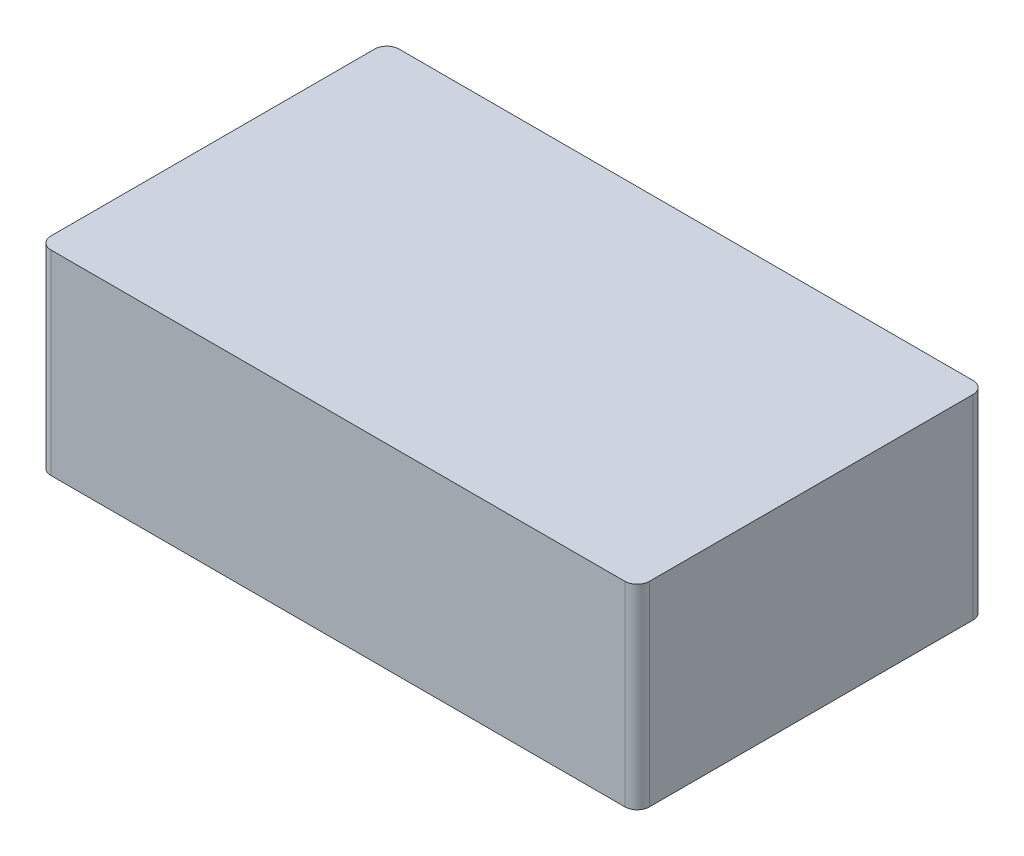
ISO-10303-21;
HEADER;
FILE_DESCRIPTION(('STEP AP214'),'2;1');
FILE_NAME('part.step','',(''),(''),'','','');
FILE_SCHEMA(('AUTOMOTIVE_DESIGN { 1 0 10303 214 1 1 1 1 }'));
ENDSEC;
DATA;
#1=APPLICATION_CONTEXT('core data for automotive mechanical design processes');
#2=APPLICATION_PROTOCOL_DEFINITION('international standard','automotive_design',2000,#1);
#3=PRODUCT_CONTEXT('',#1,'mechanical');
#4=PRODUCT('Part','Part','',(#3));
#5=PRODUCT_RELATED_PRODUCT_CATEGORY('part','',(#4));
#6=PRODUCT_DEFINITION_FORMATION('','',#4);
#7=PRODUCT_DEFINITION_CONTEXT('part definition',#1,'design');
#8=PRODUCT_DEFINITION('design','',#6,#7);
#9=PRODUCT_DEFINITION_SHAPE('','',#8);
#10=(LENGTH_UNIT() NAMED_UNIT(*) SI_UNIT(.MILLI.,.METRE.));
#11=(NAMED_UNIT(*) PLANE_ANGLE_UNIT() SI_UNIT($,.RADIAN.));
#12=(NAMED_UNIT(*) SI_UNIT($,.STERADIAN.) SOLID_ANGLE_UNIT());
#13=UNCERTAINTY_MEASURE_WITH_UNIT(LENGTH_MEASURE(1.E-05),#10,'distance_accuracy_value','');
#14=(GEOMETRIC_REPRESENTATION_CONTEXT(3) GLOBAL_UNCERTAINTY_ASSIGNED_CONTEXT((#13)) GLOBAL_UNIT_ASSIGNED_CONTEXT((#10,
#11,#12)) REPRESENTATION_CONTEXT('',''));
#15=CARTESIAN_POINT('',(0.,0.,0.));
#16=DIRECTION('',(0.,0.,1.));
#17=DIRECTION('',(1.,0.,0.));
#18=AXIS2_PLACEMENT_3D('',#15,#16,#17);
#19=CARTESIAN_POINT('',(24.5,16.,14.25));
#20=DIRECTION('',(-1.,0.,0.));
#21=DIRECTION('',(0.,0.,1.));
#22=AXIS2_PLACEMENT_3D('',#19,#20,#21);
#23=PLANE('',#22);
#24=DIRECTION('',(0.,0.,-1.));
#25=VECTOR('',#24,1.);
#26=CARTESIAN_POINT('',(24.5,0.,14.25));
#27=LINE('',#26,#25);
#28=CARTESIAN_POINT('',(24.5,0.,13.25));
#29=VERTEX_POINT('',#28);
#30=CARTESIAN_POINT('',(24.5,0.,-13.25));
#31=VERTEX_POINT('',#30);
#32=EDGE_CURVE('E129',#29,#31,#27,.T.);
#33=ORIENTED_EDGE('',*,*,#32,.T.);
#34=DIRECTION('',(0.,-1.,0.));
#35=VECTOR('',#34,1.);
#36=CARTESIAN_POINT('',(24.5,16.,-13.25));
#37=LINE('',#36,#35);
#38=CARTESIAN_POINT('',(24.5,16.,-13.25));
#39=VERTEX_POINT('',#38);
#40=EDGE_CURVE('E152',#31,#39,#37,.F.);
#41=ORIENTED_EDGE('',*,*,#40,.T.);
#42=DIRECTION('',(0.,0.,-1.));
#43=VECTOR('',#42,1.);
#44=CARTESIAN_POINT('',(24.5,16.,14.25));
#45=LINE('',#44,#43);
#46=CARTESIAN_POINT('',(24.5,16.,13.25));
#47=VERTEX_POINT('',#46);
#48=EDGE_CURVE('E127',#47,#39,#45,.T.);
#49=ORIENTED_EDGE('',*,*,#48,.F.);
#50=DIRECTION('',(0.,-1.,0.));
#51=VECTOR('',#50,1.);
#52=CARTESIAN_POINT('',(24.5,16.,13.25));
#53=LINE('',#52,#51);
#54=EDGE_CURVE('E149',#47,#29,#53,.T.);
#55=ORIENTED_EDGE('',*,*,#54,.T.);
#56=EDGE_LOOP('',(#33,#41,#49,#55));
#57=FACE_BOUND('',#56,.T.);
#58=ADVANCED_FACE('F34',(#57),#23,.F.);
#59=CARTESIAN_POINT('',(-24.5,16.,-14.25));
#60=DIRECTION('',(0.,0.,1.));
#61=DIRECTION('',(1.,0.,0.));
#62=AXIS2_PLACEMENT_3D('',#59,#60,#61);
#63=PLANE('',#62);
#64=DIRECTION('',(-1.,0.,0.));
#65=VECTOR('',#64,1.);
#66=CARTESIAN_POINT('',(-24.5,0.,-14.25));
#67=LINE('',#66,#65);
#68=CARTESIAN_POINT('',(23.5,0.,-14.25));
#69=VERTEX_POINT('',#68);
#70=CARTESIAN_POINT('',(-23.5,0.,-14.25));
#71=VERTEX_POINT('',#70);
#72=EDGE_CURVE('E125',#69,#71,#67,.T.);
#73=ORIENTED_EDGE('',*,*,#72,.T.);
#74=DIRECTION('',(0.,-1.,0.));
#75=VECTOR('',#74,1.);
#76=CARTESIAN_POINT('',(-23.5,16.,-14.25));
#77=LINE('',#76,#75);
#78=CARTESIAN_POINT('',(-23.5,16.,-14.25));
#79=VERTEX_POINT('',#78);
#80=EDGE_CURVE('E104',#71,#79,#77,.F.);
#81=ORIENTED_EDGE('',*,*,#80,.T.);
#82=DIRECTION('',(-1.,0.,0.));
#83=VECTOR('',#82,1.);
#84=CARTESIAN_POINT('',(-24.5,16.,-14.25));
#85=LINE('',#84,#83);
#86=CARTESIAN_POINT('',(23.5,16.,-14.25));
#87=VERTEX_POINT('',#86);
#88=EDGE_CURVE('E168',#87,#79,#85,.T.);
#89=ORIENTED_EDGE('',*,*,#88,.F.);
#90=DIRECTION('',(0.,-1.,0.));
#91=VECTOR('',#90,1.);
#92=CARTESIAN_POINT('',(23.5,16.,-14.25));
#93=LINE('',#92,#91);
#94=EDGE_CURVE('E109',#87,#69,#93,.T.);
#95=ORIENTED_EDGE('',*,*,#94,.T.);
#96=EDGE_LOOP('',(#73,#81,#89,#95));
#97=FACE_BOUND('',#96,.T.);
#98=ADVANCED_FACE('F185',(#97),#63,.F.);
#99=CARTESIAN_POINT('',(-24.5,16.,14.25));
#100=DIRECTION('',(1.,0.,0.));
#101=DIRECTION('',(0.,0.,-1.));
#102=AXIS2_PLACEMENT_3D('',#99,#100,#101);
#103=PLANE('',#102);
#104=DIRECTION('',(0.,0.,1.));
#105=VECTOR('',#104,1.);
#106=CARTESIAN_POINT('',(-24.5,16.,14.25));
#107=LINE('',#106,#105);
#108=CARTESIAN_POINT('',(-24.5,16.,-13.25));
#109=VERTEX_POINT('',#108);
#110=CARTESIAN_POINT('',(-24.5,16.,13.25));
#111=VERTEX_POINT('',#110);
#112=EDGE_CURVE('E118',#109,#111,#107,.T.);
#113=ORIENTED_EDGE('',*,*,#112,.F.);
#114=DIRECTION('',(0.,-1.,0.));
#115=VECTOR('',#114,1.);
#116=CARTESIAN_POINT('',(-24.5,16.,-13.25));
#117=LINE('',#116,#115);
#118=CARTESIAN_POINT('',(-24.5,0.,-13.25));
#119=VERTEX_POINT('',#118);
#120=EDGE_CURVE('E103',#109,#119,#117,.T.);
#121=ORIENTED_EDGE('',*,*,#120,.T.);
#122=DIRECTION('',(0.,0.,1.));
#123=VECTOR('',#122,1.);
#124=CARTESIAN_POINT('',(-24.5,0.,14.25));
#125=LINE('',#124,#123);
#126=CARTESIAN_POINT('',(-24.5,0.,13.25));
#127=VERTEX_POINT('',#126);
#128=EDGE_CURVE('E116',#119,#127,#125,.T.);
#129=ORIENTED_EDGE('',*,*,#128,.T.);
#130=DIRECTION('',(0.,-1.,0.));
#131=VECTOR('',#130,1.);
#132=CARTESIAN_POINT('',(-24.5,16.,13.25));
#133=LINE('',#132,#131);
#134=EDGE_CURVE('E120',#127,#111,#133,.F.);
#135=ORIENTED_EDGE('',*,*,#134,.T.);
#136=EDGE_LOOP('',(#113,#121,#129,#135));
#137=FACE_BOUND('',#136,.T.);
#138=ADVANCED_FACE('F115',(#137),#103,.F.);
#139=CARTESIAN_POINT('',(-24.5,16.,14.25));
#140=DIRECTION('',(0.,0.,-1.));
#141=DIRECTION('',(-1.,0.,0.));
#142=AXIS2_PLACEMENT_3D('',#139,#140,#141);
#143=PLANE('',#142);
#144=DIRECTION('',(1.,0.,0.));
#145=VECTOR('',#144,1.);
#146=CARTESIAN_POINT('',(-24.5,0.,14.25));
#147=LINE('',#146,#145);
#148=CARTESIAN_POINT('',(-23.5,0.,14.25));
#149=VERTEX_POINT('',#148);
#150=CARTESIAN_POINT('',(23.5,0.,14.25));
#151=VERTEX_POINT('',#150);
#152=EDGE_CURVE('E124',#149,#151,#147,.T.);
#153=ORIENTED_EDGE('',*,*,#152,.T.);
#154=DIRECTION('',(0.,-1.,0.));
#155=VECTOR('',#154,1.);
#156=CARTESIAN_POINT('',(23.5,16.,14.25));
#157=LINE('',#156,#155);
#158=CARTESIAN_POINT('',(23.5,16.,14.25));
#159=VERTEX_POINT('',#158);
#160=EDGE_CURVE('E11',#151,#159,#157,.F.);
#161=ORIENTED_EDGE('',*,*,#160,.T.);
#162=DIRECTION('',(1.,0.,0.));
#163=VECTOR('',#162,1.);
#164=CARTESIAN_POINT('',(-24.5,16.,14.25));
#165=LINE('',#164,#163);
#166=CARTESIAN_POINT('',(-23.5,16.,14.25));
#167=VERTEX_POINT('',#166);
#168=EDGE_CURVE('E133',#167,#159,#165,.T.);
#169=ORIENTED_EDGE('',*,*,#168,.F.);
#170=DIRECTION('',(0.,-1.,0.));
#171=VECTOR('',#170,1.);
#172=CARTESIAN_POINT('',(-23.5,16.,14.25));
#173=LINE('',#172,#171);
#174=EDGE_CURVE('E42',#167,#149,#173,.T.);
#175=ORIENTED_EDGE('',*,*,#174,.T.);
#176=EDGE_LOOP('',(#153,#161,#169,#175));
#177=FACE_BOUND('',#176,.T.);
#178=ADVANCED_FACE('F155',(#177),#143,.F.);
#179=CARTESIAN_POINT('',(0.,16.,0.));
#180=DIRECTION('',(0.,-1.,0.));
#181=DIRECTION('',(0.,0.,-1.));
#182=AXIS2_PLACEMENT_3D('',#179,#180,#181);
#183=PLANE('',#182);
#184=ORIENTED_EDGE('',*,*,#88,.T.);
#185=CARTESIAN_POINT('',(-23.5,16.,-13.25));
#186=DIRECTION('',(0.,-1.,0.));
#187=DIRECTION('',(0.,0.,-1.));
#188=AXIS2_PLACEMENT_3D('',#185,#186,#187);
#189=CIRCLE('',#188,1.);
#190=EDGE_CURVE('E147',#79,#109,#189,.F.);
#191=ORIENTED_EDGE('',*,*,#190,.T.);
#192=ORIENTED_EDGE('',*,*,#112,.T.);
#193=CARTESIAN_POINT('',(-23.5,16.,13.25));
#194=DIRECTION('',(0.,-1.,0.));
#195=DIRECTION('',(0.,0.,-1.));
#196=AXIS2_PLACEMENT_3D('',#193,#194,#195);
#197=CIRCLE('',#196,1.);
#198=EDGE_CURVE('E54',#111,#167,#197,.F.);
#199=ORIENTED_EDGE('',*,*,#198,.T.);
#200=ORIENTED_EDGE('',*,*,#168,.T.);
#201=CARTESIAN_POINT('',(23.5,16.,13.25));
#202=DIRECTION('',(0.,-1.,0.));
#203=DIRECTION('',(0.,0.,-1.));
#204=AXIS2_PLACEMENT_3D('',#201,#202,#203);
#205=CIRCLE('',#204,1.);
#206=EDGE_CURVE('E143',#159,#47,#205,.F.);
#207=ORIENTED_EDGE('',*,*,#206,.T.);
#208=ORIENTED_EDGE('',*,*,#48,.T.);
#209=CARTESIAN_POINT('',(23.5,16.,-13.25));
#210=DIRECTION('',(0.,-1.,0.));
#211=DIRECTION('',(0.,0.,-1.));
#212=AXIS2_PLACEMENT_3D('',#209,#210,#211);
#213=CIRCLE('',#212,1.);
#214=EDGE_CURVE('E145',#39,#87,#213,.F.);
#215=ORIENTED_EDGE('',*,*,#214,.T.);
#216=EDGE_LOOP('',(#184,#191,#192,#199,#200,#207,#208,#215));
#217=FACE_BOUND('',#216,.T.);
#218=ADVANCED_FACE('F174',(#217),#183,.F.);
#219=CARTESIAN_POINT('',(0.,0.,0.));
#220=DIRECTION('',(0.,-1.,0.));
#221=DIRECTION('',(0.,0.,-1.));
#222=AXIS2_PLACEMENT_3D('',#219,#220,#221);
#223=PLANE('',#222);
#224=ORIENTED_EDGE('',*,*,#128,.F.);
#225=CARTESIAN_POINT('',(-23.5,0.,-13.25));
#226=DIRECTION('',(0.,-1.,0.));
#227=DIRECTION('',(0.,0.,-1.));
#228=AXIS2_PLACEMENT_3D('',#225,#226,#227);
#229=CIRCLE('',#228,1.);
#230=EDGE_CURVE('E99',#119,#71,#229,.T.);
#231=ORIENTED_EDGE('',*,*,#230,.T.);
#232=ORIENTED_EDGE('',*,*,#72,.F.);
#233=CARTESIAN_POINT('',(23.5,0.,-13.25));
#234=DIRECTION('',(0.,-1.,0.));
#235=DIRECTION('',(0.,0.,-1.));
#236=AXIS2_PLACEMENT_3D('',#233,#234,#235);
#237=CIRCLE('',#236,1.);
#238=EDGE_CURVE('E110',#69,#31,#237,.T.);
#239=ORIENTED_EDGE('',*,*,#238,.T.);
#240=ORIENTED_EDGE('',*,*,#32,.F.);
#241=CARTESIAN_POINT('',(23.5,0.,13.25));
#242=DIRECTION('',(0.,-1.,0.));
#243=DIRECTION('',(0.,0.,-1.));
#244=AXIS2_PLACEMENT_3D('',#241,#242,#243);
#245=CIRCLE('',#244,1.);
#246=EDGE_CURVE('E136',#29,#151,#245,.T.);
#247=ORIENTED_EDGE('',*,*,#246,.T.);
#248=ORIENTED_EDGE('',*,*,#152,.F.);
#249=CARTESIAN_POINT('',(-23.5,0.,13.25));
#250=DIRECTION('',(0.,-1.,0.));
#251=DIRECTION('',(0.,0.,-1.));
#252=AXIS2_PLACEMENT_3D('',#249,#250,#251);
#253=CIRCLE('',#252,1.);
#254=EDGE_CURVE('E119',#149,#127,#253,.T.);
#255=ORIENTED_EDGE('',*,*,#254,.T.);
#256=EDGE_LOOP('',(#224,#231,#232,#239,#240,#247,#248,#255));
#257=FACE_BOUND('',#256,.T.);
#258=ADVANCED_FACE('F122',(#257),#223,.T.);
#259=CARTESIAN_POINT('',(-23.5,16.,-13.25));
#260=DIRECTION('',(0.,-1.,0.));
#261=DIRECTION('',(0.,0.,-1.));
#262=AXIS2_PLACEMENT_3D('',#259,#260,#261);
#263=CYLINDRICAL_SURFACE('',#262,1.);
#264=ORIENTED_EDGE('',*,*,#190,.F.);
#265=ORIENTED_EDGE('',*,*,#80,.F.);
#266=ORIENTED_EDGE('',*,*,#230,.F.);
#267=ORIENTED_EDGE('',*,*,#120,.F.);
#268=EDGE_LOOP('',(#264,#265,#266,#267));
#269=FACE_BOUND('',#268,.T.);
#270=ADVANCED_FACE('F102',(#269),#263,.T.);
#271=CARTESIAN_POINT('',(23.5,16.,-13.25));
#272=DIRECTION('',(0.,-1.,0.));
#273=DIRECTION('',(0.,0.,-1.));
#274=AXIS2_PLACEMENT_3D('',#271,#272,#273);
#275=CYLINDRICAL_SURFACE('',#274,1.);
#276=ORIENTED_EDGE('',*,*,#214,.F.);
#277=ORIENTED_EDGE('',*,*,#40,.F.);
#278=ORIENTED_EDGE('',*,*,#238,.F.);
#279=ORIENTED_EDGE('',*,*,#94,.F.);
#280=EDGE_LOOP('',(#276,#277,#278,#279));
#281=FACE_BOUND('',#280,.T.);
#282=ADVANCED_FACE('F196',(#281),#275,.T.);
#283=CARTESIAN_POINT('',(23.5,16.,13.25));
#284=DIRECTION('',(0.,-1.,0.));
#285=DIRECTION('',(0.,0.,-1.));
#286=AXIS2_PLACEMENT_3D('',#283,#284,#285);
#287=CYLINDRICAL_SURFACE('',#286,1.);
#288=ORIENTED_EDGE('',*,*,#206,.F.);
#289=ORIENTED_EDGE('',*,*,#160,.F.);
#290=ORIENTED_EDGE('',*,*,#246,.F.);
#291=ORIENTED_EDGE('',*,*,#54,.F.);
#292=EDGE_LOOP('',(#288,#289,#290,#291));
#293=FACE_BOUND('',#292,.T.);
#294=ADVANCED_FACE('F162',(#293),#287,.T.);
#295=CARTESIAN_POINT('',(-23.5,16.,13.25));
#296=DIRECTION('',(0.,-1.,0.));
#297=DIRECTION('',(0.,0.,-1.));
#298=AXIS2_PLACEMENT_3D('',#295,#296,#297);
#299=CYLINDRICAL_SURFACE('',#298,1.);
#300=ORIENTED_EDGE('',*,*,#198,.F.);
#301=ORIENTED_EDGE('',*,*,#134,.F.);
#302=ORIENTED_EDGE('',*,*,#254,.F.);
#303=ORIENTED_EDGE('',*,*,#174,.F.);
#304=EDGE_LOOP('',(#300,#301,#302,#303));
#305=FACE_BOUND('',#304,.T.);
#306=ADVANCED_FACE('F36',(#305),#299,.T.);
#307=CLOSED_SHELL('',(#58,#98,#138,#178,#218,#258,#270,#282,#294,#306));
#308=MANIFOLD_SOLID_BREP('B2',#307);
#309=ADVANCED_BREP_SHAPE_REPRESENTATION('',(#18,#308),#14);
#310=SHAPE_DEFINITION_REPRESENTATION(#9,#309);
ENDSEC;
END-ISO-10303-21;
